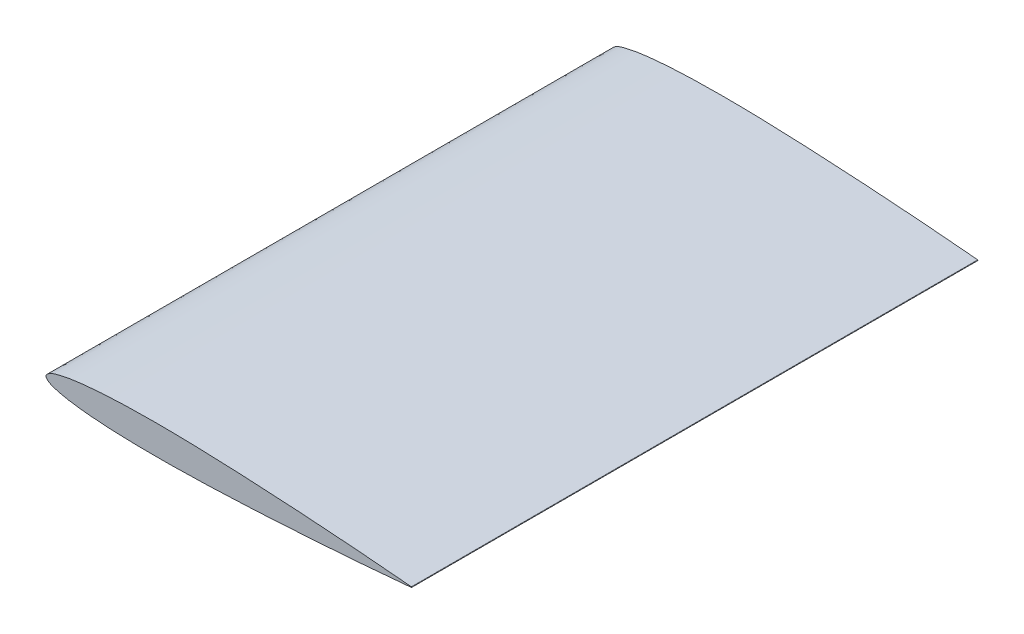
ISO-10303-21;
HEADER;
FILE_DESCRIPTION(('STEP AP214'),'2;1');
FILE_NAME('part.step','',(''),(''),'','','');
FILE_SCHEMA(('AUTOMOTIVE_DESIGN { 1 0 10303 214 1 1 1 1 }'));
ENDSEC;
DATA;
#1=APPLICATION_CONTEXT('core data for automotive mechanical design processes');
#2=APPLICATION_PROTOCOL_DEFINITION('international standard','automotive_design',2000,#1);
#3=PRODUCT_CONTEXT('',#1,'mechanical');
#4=PRODUCT('Part','Part','',(#3));
#5=PRODUCT_RELATED_PRODUCT_CATEGORY('part','',(#4));
#6=PRODUCT_DEFINITION_FORMATION('','',#4);
#7=PRODUCT_DEFINITION_CONTEXT('part definition',#1,'design');
#8=PRODUCT_DEFINITION('design','',#6,#7);
#9=PRODUCT_DEFINITION_SHAPE('','',#8);
#10=(LENGTH_UNIT() NAMED_UNIT(*) SI_UNIT(.MILLI.,.METRE.));
#11=(NAMED_UNIT(*) PLANE_ANGLE_UNIT() SI_UNIT($,.RADIAN.));
#12=(NAMED_UNIT(*) SI_UNIT($,.STERADIAN.) SOLID_ANGLE_UNIT());
#13=UNCERTAINTY_MEASURE_WITH_UNIT(LENGTH_MEASURE(1.E-05),#10,'distance_accuracy_value','');
#14=(GEOMETRIC_REPRESENTATION_CONTEXT(3) GLOBAL_UNCERTAINTY_ASSIGNED_CONTEXT((#13)) GLOBAL_UNIT_ASSIGNED_CONTEXT((#10,
#11,#12)) REPRESENTATION_CONTEXT('',''));
#15=CARTESIAN_POINT('',(0.,0.,0.));
#16=DIRECTION('',(0.,0.,1.));
#17=DIRECTION('',(1.,0.,0.));
#18=AXIS2_PLACEMENT_3D('',#15,#16,#17);
#19=CARTESIAN_POINT('',(100.,0.084,132.));
#20=CARTESIAN_POINT('',(98.333488814933,0.236746480055364,132.));
#21=CARTESIAN_POINT('',(95.0011947254255,0.542172688557606,132.));
#22=CARTESIAN_POINT('',(88.3355596211879,1.11089898015662,132.));
#23=CARTESIAN_POINT('',(80.0032933562199,1.76361099520967,132.));
#24=CARTESIAN_POINT('',(70.0029989334555,2.45786169254404,132.));
#25=CARTESIAN_POINT('',(60.0031046254057,3.06174772348002,132.));
#26=CARTESIAN_POINT('',(50.0030086005351,3.55213921170033,132.));
#27=CARTESIAN_POINT('',(40.0025985576922,3.90294649372571,132.));
#28=CARTESIAN_POINT('',(31.666961485844,4.02526015065941,132.));
#29=CARTESIAN_POINT('',(24.9991546003269,3.97693379087482,132.));
#30=CARTESIAN_POINT('',(19.9977755867835,3.84497639830756,132.));
#31=CARTESIAN_POINT('',(14.9933631314586,3.59248695861782,132.));
#32=CARTESIAN_POINT('',(10.8271840648808,3.23765157891607,132.));
#33=CARTESIAN_POINT('',(7.48905438800269,2.81402136675529,132.));
#34=CARTESIAN_POINT('',(4.99359465012965,2.40367305928858,132.));
#35=CARTESIAN_POINT('',(2.84962633983361,1.86792549429032,132.));
#36=CARTESIAN_POINT('',(1.16541350274339,1.32098725183071,132.));
#37=CARTESIAN_POINT('',(-0.664613784127027,0.,132.));
#38=CARTESIAN_POINT('',(1.16541350274339,-1.32098725183071,132.));
#39=CARTESIAN_POINT('',(2.84962633983362,-1.86792549429032,132.));
#40=CARTESIAN_POINT('',(4.99359465012963,-2.40367305928857,132.));
#41=CARTESIAN_POINT('',(7.48905438800269,-2.81402136675529,132.));
#42=CARTESIAN_POINT('',(10.8271840648809,-3.23765157891607,132.));
#43=CARTESIAN_POINT('',(14.9933631314586,-3.59248695861782,132.));
#44=CARTESIAN_POINT('',(19.9977755867835,-3.84497639830756,132.));
#45=CARTESIAN_POINT('',(24.9991546003269,-3.97693379087482,132.));
#46=CARTESIAN_POINT('',(31.666961485844,-4.02526015065941,132.));
#47=CARTESIAN_POINT('',(40.0025985576922,-3.90294649372571,132.));
#48=CARTESIAN_POINT('',(50.0030086005351,-3.55213921170033,132.));
#49=CARTESIAN_POINT('',(60.0031046254058,-3.06174772348002,132.));
#50=CARTESIAN_POINT('',(70.0029989334555,-2.45786169254404,132.));
#51=CARTESIAN_POINT('',(80.0032933562199,-1.76361099520967,132.));
#52=CARTESIAN_POINT('',(88.3355596211879,-1.11089898015662,132.));
#53=CARTESIAN_POINT('',(95.0011947254255,-0.542172688557605,132.));
#54=CARTESIAN_POINT('',(98.333488814933,-0.236746480055364,132.));
#55=CARTESIAN_POINT('',(100.,-0.084,132.));
#56=B_SPLINE_CURVE_WITH_KNOTS('',3,(#19,#20,#21,#22,#23,#24,#25,#26,#27,#28,#29,#30,#31,#32,#33,
#34,#35,#36,#37,#38,#39,#40,#41,#42,#43,#44,#45,#46,#47,#48,#49,#50,#51,#52,#53,#54,#55),
.UNSPECIFIED.,.F.,.F.,(4,1,1,1,1,1,1,1,1,1,1,1,1,1,1,1,1,1,1,1,1,1,1,1,1,1,1,1,1,1,1,1,1,1,4),
(0.,0.0248762929189861,0.0497417146704998,0.0994434021110951,0.149112224036195,
0.198750974066913,0.248359097492202,0.297937369716024,0.347491327096237,0.37226694027957,
0.39705092368842,0.421859474838904,0.446731345826762,0.459220451479859,0.471790601601357,
0.484560454432956,0.491195112481227,0.5,0.508804887518773,0.515439545567044,0.528209398398643,
0.540779548520141,0.553268654173238,0.578140525161096,0.60294907631158,0.62773305972043,
0.652508672903763,0.702062630283976,0.751640902507798,0.801249025933086,0.850887775963805,
0.900556597888905,0.9502582853295,0.975123707081014,1.),.UNSPECIFIED.);
#57=DIRECTION('',(0.,0.,-1.));
#58=VECTOR('',#57,1.);
#59=SURFACE_OF_LINEAR_EXTRUSION('',#56,#58);
#60=DIRECTION('',(0.,0.,1.));
#61=VECTOR('',#60,1.);
#62=CARTESIAN_POINT('',(100.,0.084,0.));
#63=LINE('',#62,#61);
#64=CARTESIAN_POINT('',(100.,0.084,0.));
#65=VERTEX_POINT('',#64);
#66=CARTESIAN_POINT('',(100.,0.084,155.));
#67=VERTEX_POINT('',#66);
#68=EDGE_CURVE('E43',#65,#67,#63,.T.);
#69=ORIENTED_EDGE('',*,*,#68,.F.);
#70=CARTESIAN_POINT('',(100.,0.084,0.));
#71=CARTESIAN_POINT('',(98.333488814933,0.236746480055364,0.));
#72=CARTESIAN_POINT('',(95.0011947254255,0.542172688557606,0.));
#73=CARTESIAN_POINT('',(88.3355596211879,1.11089898015662,0.));
#74=CARTESIAN_POINT('',(80.0032933562199,1.76361099520967,0.));
#75=CARTESIAN_POINT('',(70.0029989334555,2.45786169254404,0.));
#76=CARTESIAN_POINT('',(60.0031046254057,3.06174772348002,0.));
#77=CARTESIAN_POINT('',(50.0030086005351,3.55213921170033,0.));
#78=CARTESIAN_POINT('',(40.0025985576922,3.90294649372571,0.));
#79=CARTESIAN_POINT('',(31.666961485844,4.02526015065941,0.));
#80=CARTESIAN_POINT('',(24.9991546003269,3.97693379087482,0.));
#81=CARTESIAN_POINT('',(19.9977755867835,3.84497639830756,0.));
#82=CARTESIAN_POINT('',(14.9933631314586,3.59248695861782,0.));
#83=CARTESIAN_POINT('',(10.8271840648808,3.23765157891607,0.));
#84=CARTESIAN_POINT('',(7.48905438800269,2.81402136675529,0.));
#85=CARTESIAN_POINT('',(4.99359465012965,2.40367305928858,0.));
#86=CARTESIAN_POINT('',(2.84962633983361,1.86792549429032,0.));
#87=CARTESIAN_POINT('',(1.16541350274339,1.32098725183071,0.));
#88=CARTESIAN_POINT('',(-0.664613784127027,0.,0.));
#89=CARTESIAN_POINT('',(1.16541350274339,-1.32098725183071,0.));
#90=CARTESIAN_POINT('',(2.84962633983362,-1.86792549429032,0.));
#91=CARTESIAN_POINT('',(4.99359465012963,-2.40367305928857,0.));
#92=CARTESIAN_POINT('',(7.48905438800269,-2.81402136675529,0.));
#93=CARTESIAN_POINT('',(10.8271840648809,-3.23765157891607,0.));
#94=CARTESIAN_POINT('',(14.9933631314586,-3.59248695861782,0.));
#95=CARTESIAN_POINT('',(19.9977755867835,-3.84497639830756,0.));
#96=CARTESIAN_POINT('',(24.9991546003269,-3.97693379087482,0.));
#97=CARTESIAN_POINT('',(31.666961485844,-4.02526015065941,0.));
#98=CARTESIAN_POINT('',(40.0025985576922,-3.90294649372571,0.));
#99=CARTESIAN_POINT('',(50.0030086005351,-3.55213921170033,0.));
#100=CARTESIAN_POINT('',(60.0031046254058,-3.06174772348002,0.));
#101=CARTESIAN_POINT('',(70.0029989334555,-2.45786169254404,0.));
#102=CARTESIAN_POINT('',(80.0032933562199,-1.76361099520967,0.));
#103=CARTESIAN_POINT('',(88.3355596211879,-1.11089898015662,0.));
#104=CARTESIAN_POINT('',(95.0011947254255,-0.542172688557605,0.));
#105=CARTESIAN_POINT('',(98.333488814933,-0.236746480055364,0.));
#106=CARTESIAN_POINT('',(100.,-0.084,0.));
#107=B_SPLINE_CURVE_WITH_KNOTS('',3,(#70,#71,#72,#73,#74,#75,#76,#77,#78,#79,#80,#81,#82,#83,
#84,#85,#86,#87,#88,#89,#90,#91,#92,#93,#94,#95,#96,#97,#98,#99,#100,#101,#102,#103,#104,#105,
#106),.UNSPECIFIED.,.F.,.F.,(4,1,1,1,1,1,1,1,1,1,1,1,1,1,1,1,1,1,1,1,1,1,1,1,1,1,1,1,1,1,1,1,1,
1,4),(0.,0.0248762929189861,0.0497417146704998,0.0994434021110951,0.149112224036195,
0.198750974066913,0.248359097492202,0.297937369716024,0.347491327096237,0.37226694027957,
0.39705092368842,0.421859474838904,0.446731345826762,0.459220451479859,0.471790601601357,
0.484560454432956,0.491195112481227,0.5,0.508804887518773,0.515439545567044,0.528209398398643,
0.540779548520141,0.553268654173238,0.578140525161096,0.60294907631158,0.62773305972043,
0.652508672903763,0.702062630283976,0.751640902507798,0.801249025933086,0.850887775963805,
0.900556597888905,0.9502582853295,0.975123707081014,1.),.UNSPECIFIED.);
#108=CARTESIAN_POINT('',(100.,-0.084,0.));
#109=VERTEX_POINT('',#108);
#110=EDGE_CURVE('E11',#65,#109,#107,.T.);
#111=ORIENTED_EDGE('',*,*,#110,.T.);
#112=DIRECTION('',(0.,0.,1.));
#113=VECTOR('',#112,1.);
#114=CARTESIAN_POINT('',(100.,-0.084,0.));
#115=LINE('',#114,#113);
#116=CARTESIAN_POINT('',(100.,-0.084,155.));
#117=VERTEX_POINT('',#116);
#118=EDGE_CURVE('E138',#109,#117,#115,.T.);
#119=ORIENTED_EDGE('',*,*,#118,.T.);
#120=CARTESIAN_POINT('',(100.,0.084,155.));
#121=CARTESIAN_POINT('',(98.333488814933,0.236746480055364,155.));
#122=CARTESIAN_POINT('',(95.0011947254255,0.542172688557606,155.));
#123=CARTESIAN_POINT('',(88.3355596211879,1.11089898015662,155.));
#124=CARTESIAN_POINT('',(80.0032933562199,1.76361099520967,155.));
#125=CARTESIAN_POINT('',(70.0029989334555,2.45786169254404,155.));
#126=CARTESIAN_POINT('',(60.0031046254057,3.06174772348002,155.));
#127=CARTESIAN_POINT('',(50.0030086005351,3.55213921170033,155.));
#128=CARTESIAN_POINT('',(40.0025985576922,3.90294649372571,155.));
#129=CARTESIAN_POINT('',(31.666961485844,4.02526015065941,155.));
#130=CARTESIAN_POINT('',(24.9991546003269,3.97693379087482,155.));
#131=CARTESIAN_POINT('',(19.9977755867835,3.84497639830756,155.));
#132=CARTESIAN_POINT('',(14.9933631314586,3.59248695861782,155.));
#133=CARTESIAN_POINT('',(10.8271840648808,3.23765157891607,155.));
#134=CARTESIAN_POINT('',(7.48905438800269,2.81402136675529,155.));
#135=CARTESIAN_POINT('',(4.99359465012965,2.40367305928858,155.));
#136=CARTESIAN_POINT('',(2.84962633983361,1.86792549429032,155.));
#137=CARTESIAN_POINT('',(1.16541350274339,1.32098725183071,155.));
#138=CARTESIAN_POINT('',(-0.664613784127027,0.,155.));
#139=CARTESIAN_POINT('',(1.16541350274339,-1.32098725183071,155.));
#140=CARTESIAN_POINT('',(2.84962633983362,-1.86792549429032,155.));
#141=CARTESIAN_POINT('',(4.99359465012963,-2.40367305928857,155.));
#142=CARTESIAN_POINT('',(7.48905438800269,-2.81402136675529,155.));
#143=CARTESIAN_POINT('',(10.8271840648809,-3.23765157891607,155.));
#144=CARTESIAN_POINT('',(14.9933631314586,-3.59248695861782,155.));
#145=CARTESIAN_POINT('',(19.9977755867835,-3.84497639830756,155.));
#146=CARTESIAN_POINT('',(24.9991546003269,-3.97693379087482,155.));
#147=CARTESIAN_POINT('',(31.666961485844,-4.02526015065941,155.));
#148=CARTESIAN_POINT('',(40.0025985576922,-3.90294649372571,155.));
#149=CARTESIAN_POINT('',(50.0030086005351,-3.55213921170033,155.));
#150=CARTESIAN_POINT('',(60.0031046254058,-3.06174772348002,155.));
#151=CARTESIAN_POINT('',(70.0029989334555,-2.45786169254404,155.));
#152=CARTESIAN_POINT('',(80.0032933562199,-1.76361099520967,155.));
#153=CARTESIAN_POINT('',(88.3355596211879,-1.11089898015662,155.));
#154=CARTESIAN_POINT('',(95.0011947254255,-0.542172688557605,155.));
#155=CARTESIAN_POINT('',(98.333488814933,-0.236746480055364,155.));
#156=CARTESIAN_POINT('',(100.,-0.084,155.));
#157=B_SPLINE_CURVE_WITH_KNOTS('',3,(#120,#121,#122,#123,#124,#125,#126,#127,#128,#129,#130,
#131,#132,#133,#134,#135,#136,#137,#138,#139,#140,#141,#142,#143,#144,#145,#146,#147,#148,#149,
#150,#151,#152,#153,#154,#155,#156),.UNSPECIFIED.,.F.,.F.,(4,1,1,1,1,1,1,1,1,1,1,1,1,1,1,1,1,1,
1,1,1,1,1,1,1,1,1,1,1,1,1,1,1,1,4),(0.,0.0248762929189861,0.0497417146704998,0.0994434021110951,
0.149112224036195,0.198750974066913,0.248359097492202,0.297937369716024,0.347491327096237,
0.37226694027957,0.39705092368842,0.421859474838904,0.446731345826762,0.459220451479859,
0.471790601601357,0.484560454432956,0.491195112481227,0.5,0.508804887518773,0.515439545567044,
0.528209398398643,0.540779548520141,0.553268654173238,0.578140525161096,0.60294907631158,
0.62773305972043,0.652508672903763,0.702062630283976,0.751640902507798,0.801249025933086,
0.850887775963805,0.900556597888905,0.9502582853295,0.975123707081014,1.),.UNSPECIFIED.);
#158=EDGE_CURVE('E121',#67,#117,#157,.T.);
#159=ORIENTED_EDGE('',*,*,#158,.F.);
#160=EDGE_LOOP('',(#69,#111,#119,#159));
#161=FACE_BOUND('',#160,.T.);
#162=ADVANCED_FACE('F34',(#161),#59,.F.);
#163=CARTESIAN_POINT('',(0.,0.,0.));
#164=DIRECTION('',(0.,0.,-1.));
#165=DIRECTION('',(-1.,0.,0.));
#166=AXIS2_PLACEMENT_3D('',#163,#164,#165);
#167=PLANE('',#166);
#168=DIRECTION('',(0.,-1.,0.));
#169=VECTOR('',#168,1.);
#170=CARTESIAN_POINT('',(55.,2.,0.));
#171=LINE('',#170,#169);
#172=CARTESIAN_POINT('',(55.,2.,0.));
#173=VERTEX_POINT('',#172);
#174=CARTESIAN_POINT('',(55.,-2.,0.));
#175=VERTEX_POINT('',#174);
#176=EDGE_CURVE('E50',#173,#175,#171,.T.);
#177=ORIENTED_EDGE('',*,*,#176,.F.);
#178=DIRECTION('',(1.,0.,0.));
#179=VECTOR('',#178,1.);
#180=CARTESIAN_POINT('',(15.,2.,0.));
#181=LINE('',#180,#179);
#182=CARTESIAN_POINT('',(15.,2.,0.));
#183=VERTEX_POINT('',#182);
#184=EDGE_CURVE('E106',#183,#173,#181,.T.);
#185=ORIENTED_EDGE('',*,*,#184,.F.);
#186=DIRECTION('',(0.,1.,0.));
#187=VECTOR('',#186,1.);
#188=CARTESIAN_POINT('',(15.,2.,0.));
#189=LINE('',#188,#187);
#190=CARTESIAN_POINT('',(15.,-2.,0.));
#191=VERTEX_POINT('',#190);
#192=EDGE_CURVE('E109',#191,#183,#189,.T.);
#193=ORIENTED_EDGE('',*,*,#192,.F.);
#194=DIRECTION('',(-1.,0.,0.));
#195=VECTOR('',#194,1.);
#196=CARTESIAN_POINT('',(15.,-2.,0.));
#197=LINE('',#196,#195);
#198=EDGE_CURVE('E115',#175,#191,#197,.T.);
#199=ORIENTED_EDGE('',*,*,#198,.F.);
#200=EDGE_LOOP('',(#177,#185,#193,#199));
#201=FACE_BOUND('',#200,.T.);
#202=ORIENTED_EDGE('',*,*,#110,.F.);
#203=CARTESIAN_POINT('',(100.,0.,0.));
#204=DIRECTION('',(0.,0.,1.));
#205=DIRECTION('',(-1.,0.,0.));
#206=AXIS2_PLACEMENT_3D('',#203,#204,#205);
#207=CIRCLE('',#206,0.084);
#208=EDGE_CURVE('E135',#109,#65,#207,.T.);
#209=ORIENTED_EDGE('',*,*,#208,.F.);
#210=EDGE_LOOP('',(#202,#209));
#211=FACE_BOUND('',#210,.T.);
#212=ADVANCED_FACE('F162',(#201,#211),#167,.T.);
#213=CARTESIAN_POINT('',(100.,0.,0.));
#214=DIRECTION('',(0.,0.,1.));
#215=DIRECTION('',(1.,0.,0.));
#216=AXIS2_PLACEMENT_3D('',#213,#214,#215);
#217=CYLINDRICAL_SURFACE('',#216,0.084);
#218=ORIENTED_EDGE('',*,*,#68,.T.);
#219=CARTESIAN_POINT('',(100.,0.,155.));
#220=DIRECTION('',(0.,0.,1.));
#221=DIRECTION('',(-1.,0.,0.));
#222=AXIS2_PLACEMENT_3D('',#219,#220,#221);
#223=CIRCLE('',#222,0.084);
#224=EDGE_CURVE('E129',#117,#67,#223,.T.);
#225=ORIENTED_EDGE('',*,*,#224,.F.);
#226=ORIENTED_EDGE('',*,*,#118,.F.);
#227=ORIENTED_EDGE('',*,*,#208,.T.);
#228=EDGE_LOOP('',(#218,#225,#226,#227));
#229=FACE_BOUND('',#228,.T.);
#230=ADVANCED_FACE('F151',(#229),#217,.T.);
#231=CARTESIAN_POINT('',(0.,0.,155.));
#232=DIRECTION('',(0.,0.,-1.));
#233=DIRECTION('',(-1.,0.,0.));
#234=AXIS2_PLACEMENT_3D('',#231,#232,#233);
#235=PLANE('',#234);
#236=ORIENTED_EDGE('',*,*,#158,.T.);
#237=ORIENTED_EDGE('',*,*,#224,.T.);
#238=EDGE_LOOP('',(#236,#237));
#239=FACE_BOUND('',#238,.T.);
#240=ADVANCED_FACE('F153',(#239),#235,.F.);
#241=CARTESIAN_POINT('',(55.,2.,18.));
#242=DIRECTION('',(1.,0.,0.));
#243=DIRECTION('',(0.,0.,-1.));
#244=AXIS2_PLACEMENT_3D('',#241,#242,#243);
#245=PLANE('',#244);
#246=ORIENTED_EDGE('',*,*,#176,.T.);
#247=DIRECTION('',(0.,0.,-1.));
#248=VECTOR('',#247,1.);
#249=CARTESIAN_POINT('',(55.,-2.,18.));
#250=LINE('',#249,#248);
#251=CARTESIAN_POINT('',(55.,-2.,18.));
#252=VERTEX_POINT('',#251);
#253=EDGE_CURVE('E84',#252,#175,#250,.T.);
#254=ORIENTED_EDGE('',*,*,#253,.F.);
#255=DIRECTION('',(0.,-1.,0.));
#256=VECTOR('',#255,1.);
#257=CARTESIAN_POINT('',(55.,2.,18.));
#258=LINE('',#257,#256);
#259=CARTESIAN_POINT('',(55.,2.,18.));
#260=VERTEX_POINT('',#259);
#261=EDGE_CURVE('E88',#260,#252,#258,.T.);
#262=ORIENTED_EDGE('',*,*,#261,.F.);
#263=DIRECTION('',(0.,0.,-1.));
#264=VECTOR('',#263,1.);
#265=CARTESIAN_POINT('',(55.,2.,18.));
#266=LINE('',#265,#264);
#267=EDGE_CURVE('E119',#260,#173,#266,.T.);
#268=ORIENTED_EDGE('',*,*,#267,.T.);
#269=EDGE_LOOP('',(#246,#254,#262,#268));
#270=FACE_BOUND('',#269,.T.);
#271=ADVANCED_FACE('F86',(#270),#245,.F.);
#272=CARTESIAN_POINT('',(15.,2.,18.));
#273=DIRECTION('',(0.,1.,0.));
#274=DIRECTION('',(-1.,0.,0.));
#275=AXIS2_PLACEMENT_3D('',#272,#273,#274);
#276=PLANE('',#275);
#277=ORIENTED_EDGE('',*,*,#184,.T.);
#278=ORIENTED_EDGE('',*,*,#267,.F.);
#279=DIRECTION('',(1.,0.,0.));
#280=VECTOR('',#279,1.);
#281=CARTESIAN_POINT('',(15.,2.,18.));
#282=LINE('',#281,#280);
#283=CARTESIAN_POINT('',(15.,2.,18.));
#284=VERTEX_POINT('',#283);
#285=EDGE_CURVE('E94',#284,#260,#282,.T.);
#286=ORIENTED_EDGE('',*,*,#285,.F.);
#287=DIRECTION('',(0.,0.,-1.));
#288=VECTOR('',#287,1.);
#289=CARTESIAN_POINT('',(15.,2.,18.));
#290=LINE('',#289,#288);
#291=EDGE_CURVE('E122',#284,#183,#290,.T.);
#292=ORIENTED_EDGE('',*,*,#291,.T.);
#293=EDGE_LOOP('',(#277,#278,#286,#292));
#294=FACE_BOUND('',#293,.T.);
#295=ADVANCED_FACE('F160',(#294),#276,.F.);
#296=CARTESIAN_POINT('',(15.,2.,18.));
#297=DIRECTION('',(-1.,0.,0.));
#298=DIRECTION('',(0.,0.,1.));
#299=AXIS2_PLACEMENT_3D('',#296,#297,#298);
#300=PLANE('',#299);
#301=ORIENTED_EDGE('',*,*,#192,.T.);
#302=ORIENTED_EDGE('',*,*,#291,.F.);
#303=DIRECTION('',(0.,1.,0.));
#304=VECTOR('',#303,1.);
#305=CARTESIAN_POINT('',(15.,2.,18.));
#306=LINE('',#305,#304);
#307=CARTESIAN_POINT('',(15.,-2.,18.));
#308=VERTEX_POINT('',#307);
#309=EDGE_CURVE('E102',#308,#284,#306,.T.);
#310=ORIENTED_EDGE('',*,*,#309,.F.);
#311=DIRECTION('',(0.,0.,-1.));
#312=VECTOR('',#311,1.);
#313=CARTESIAN_POINT('',(15.,-2.,18.));
#314=LINE('',#313,#312);
#315=EDGE_CURVE('E93',#308,#191,#314,.T.);
#316=ORIENTED_EDGE('',*,*,#315,.T.);
#317=EDGE_LOOP('',(#301,#302,#310,#316));
#318=FACE_BOUND('',#317,.T.);
#319=ADVANCED_FACE('F174',(#318),#300,.F.);
#320=CARTESIAN_POINT('',(15.,-2.,18.));
#321=DIRECTION('',(0.,-1.,0.));
#322=DIRECTION('',(1.,0.,0.));
#323=AXIS2_PLACEMENT_3D('',#320,#321,#322);
#324=PLANE('',#323);
#325=ORIENTED_EDGE('',*,*,#198,.T.);
#326=ORIENTED_EDGE('',*,*,#315,.F.);
#327=DIRECTION('',(-1.,0.,0.));
#328=VECTOR('',#327,1.);
#329=CARTESIAN_POINT('',(15.,-2.,18.));
#330=LINE('',#329,#328);
#331=EDGE_CURVE('E97',#252,#308,#330,.T.);
#332=ORIENTED_EDGE('',*,*,#331,.F.);
#333=ORIENTED_EDGE('',*,*,#253,.T.);
#334=EDGE_LOOP('',(#325,#326,#332,#333));
#335=FACE_BOUND('',#334,.T.);
#336=ADVANCED_FACE('F98',(#335),#324,.F.);
#337=CARTESIAN_POINT('',(0.,0.,18.));
#338=DIRECTION('',(0.,0.,1.));
#339=DIRECTION('',(1.,0.,0.));
#340=AXIS2_PLACEMENT_3D('',#337,#338,#339);
#341=PLANE('',#340);
#342=ORIENTED_EDGE('',*,*,#261,.T.);
#343=ORIENTED_EDGE('',*,*,#331,.T.);
#344=ORIENTED_EDGE('',*,*,#309,.T.);
#345=ORIENTED_EDGE('',*,*,#285,.T.);
#346=EDGE_LOOP('',(#342,#343,#344,#345));
#347=FACE_BOUND('',#346,.T.);
#348=ADVANCED_FACE('F104',(#347),#341,.F.);
#349=CLOSED_SHELL('',(#162,#212,#230,#240,#271,#295,#319,#336,#348));
#350=MANIFOLD_SOLID_BREP('B2',#349);
#351=ADVANCED_BREP_SHAPE_REPRESENTATION('',(#18,#350),#14);
#352=SHAPE_DEFINITION_REPRESENTATION(#9,#351);
ENDSEC;
END-ISO-10303-21;
